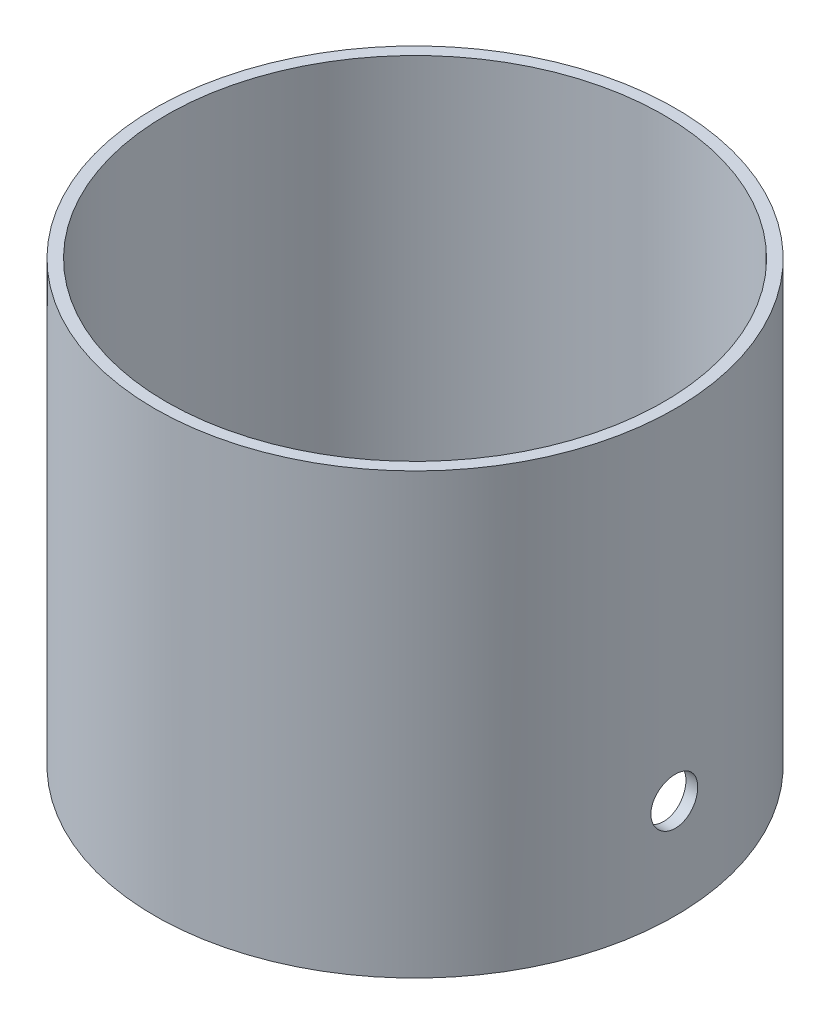
ISO-10303-21;
HEADER;
FILE_DESCRIPTION(('STEP AP214'),'2;1');
FILE_NAME('part.step','',(''),(''),'','','');
FILE_SCHEMA(('AUTOMOTIVE_DESIGN { 1 0 10303 214 1 1 1 1 }'));
ENDSEC;
DATA;
#1=APPLICATION_CONTEXT('core data for automotive mechanical design processes');
#2=APPLICATION_PROTOCOL_DEFINITION('international standard','automotive_design',2000,#1);
#3=PRODUCT_CONTEXT('',#1,'mechanical');
#4=PRODUCT('Part','Part','',(#3));
#5=PRODUCT_RELATED_PRODUCT_CATEGORY('part','',(#4));
#6=PRODUCT_DEFINITION_FORMATION('','',#4);
#7=PRODUCT_DEFINITION_CONTEXT('part definition',#1,'design');
#8=PRODUCT_DEFINITION('design','',#6,#7);
#9=PRODUCT_DEFINITION_SHAPE('','',#8);
#10=(LENGTH_UNIT() NAMED_UNIT(*) SI_UNIT(.MILLI.,.METRE.));
#11=(NAMED_UNIT(*) PLANE_ANGLE_UNIT() SI_UNIT($,.RADIAN.));
#12=(NAMED_UNIT(*) SI_UNIT($,.STERADIAN.) SOLID_ANGLE_UNIT());
#13=UNCERTAINTY_MEASURE_WITH_UNIT(LENGTH_MEASURE(1.E-05),#10,'distance_accuracy_value','');
#14=(GEOMETRIC_REPRESENTATION_CONTEXT(3) GLOBAL_UNCERTAINTY_ASSIGNED_CONTEXT((#13)) GLOBAL_UNIT_ASSIGNED_CONTEXT((#10,
#11,#12)) REPRESENTATION_CONTEXT('',''));
#15=CARTESIAN_POINT('',(0.,0.,0.));
#16=DIRECTION('',(0.,0.,1.));
#17=DIRECTION('',(1.,0.,0.));
#18=AXIS2_PLACEMENT_3D('',#15,#16,#17);
#19=CARTESIAN_POINT('',(0.,37.5,0.));
#20=DIRECTION('',(0.,-1.,0.));
#21=DIRECTION('',(0.,0.,-1.));
#22=AXIS2_PLACEMENT_3D('',#19,#20,#21);
#23=CYLINDRICAL_SURFACE('',#22,44.45);
#24=CARTESIAN_POINT('',(0.,37.5,0.));
#25=DIRECTION('',(0.,1.,0.));
#26=DIRECTION('',(0.,0.,1.));
#27=AXIS2_PLACEMENT_3D('',#24,#25,#26);
#28=CIRCLE('',#27,44.45);
#29=CARTESIAN_POINT('',(0.,37.5,44.45));
#30=VERTEX_POINT('',#29);
#31=EDGE_CURVE('E134',#30,#30,#28,.T.);
#32=ORIENTED_EDGE('',*,*,#31,.F.);
#33=EDGE_LOOP('',(#32));
#34=FACE_BOUND('',#33,.T.);
#35=CARTESIAN_POINT('',(0.,-29.5,0.));
#36=DIRECTION('',(0.,1.,0.));
#37=DIRECTION('',(0.,0.,1.));
#38=AXIS2_PLACEMENT_3D('',#35,#36,#37);
#39=CIRCLE('',#38,44.45);
#40=CARTESIAN_POINT('',(-44.2696566510291,-29.5,4.));
#41=VERTEX_POINT('',#40);
#42=CARTESIAN_POINT('',(-44.2696566510291,-29.5,-4.));
#43=VERTEX_POINT('',#42);
#44=EDGE_CURVE('E86',#41,#43,#39,.F.);
#45=ORIENTED_EDGE('',*,*,#44,.F.);
#46=DIRECTION('',(0.,-1.,0.));
#47=VECTOR('',#46,1.);
#48=CARTESIAN_POINT('',(-44.2696566510291,37.5,4.));
#49=LINE('',#48,#47);
#50=CARTESIAN_POINT('',(-44.2696566510291,-37.5,4.));
#51=VERTEX_POINT('',#50);
#52=EDGE_CURVE('E96',#51,#41,#49,.F.);
#53=ORIENTED_EDGE('',*,*,#52,.F.);
#54=CARTESIAN_POINT('',(0.,-37.5,0.));
#55=DIRECTION('',(0.,1.,0.));
#56=DIRECTION('',(0.,0.,1.));
#57=AXIS2_PLACEMENT_3D('',#54,#55,#56);
#58=CIRCLE('',#57,44.45);
#59=CARTESIAN_POINT('',(-44.2696566510291,-37.5,-4.));
#60=VERTEX_POINT('',#59);
#61=EDGE_CURVE('E107',#51,#60,#58,.T.);
#62=ORIENTED_EDGE('',*,*,#61,.T.);
#63=DIRECTION('',(0.,-1.,0.));
#64=VECTOR('',#63,1.);
#65=CARTESIAN_POINT('',(-44.2696566510291,37.5,-4.));
#66=LINE('',#65,#64);
#67=EDGE_CURVE('E97',#43,#60,#66,.T.);
#68=ORIENTED_EDGE('',*,*,#67,.F.);
#69=EDGE_LOOP('',(#45,#53,#62,#68));
#70=FACE_BOUND('',#69,.T.);
#71=CARTESIAN_POINT('',(44.45,-24.55,0.));
#72=CARTESIAN_POINT('',(44.4499976557764,-24.5499902380189,-0.224195243932007));
#73=CARTESIAN_POINT('',(44.4482857586796,-24.5310877604823,-0.44854145199603));
#74=CARTESIAN_POINT('',(44.4416212627403,-24.4559630281362,-0.891021924232705));
#75=CARTESIAN_POINT('',(44.4366650306759,-24.3996989322832,-1.10914893761069));
#76=CARTESIAN_POINT('',(44.4240717134448,-24.25149532707,-1.53271882928095));
#77=CARTESIAN_POINT('',(44.4164361841107,-24.1595765186722,-1.73816898761818));
#78=CARTESIAN_POINT('',(44.3993396115122,-23.942710978894,-2.13067706767654));
#79=CARTESIAN_POINT('',(44.3898789484413,-23.8177711241218,-2.31773880765753));
#80=CARTESIAN_POINT('',(44.3701618584907,-23.538013709361,-2.66875860486678));
#81=CARTESIAN_POINT('',(44.3599034153576,-23.3831188725493,-2.83265496597804));
#82=CARTESIAN_POINT('',(44.3397637790807,-23.0480123717276,-3.13216185069836));
#83=CARTESIAN_POINT('',(44.3298826028496,-22.8677995744112,-3.26777110741782));
#84=CARTESIAN_POINT('',(44.3115950772525,-22.4867938517307,-3.50706726099331));
#85=CARTESIAN_POINT('',(44.3031912746875,-22.2859663148574,-3.61069926094608));
#86=CARTESIAN_POINT('',(44.2888339268265,-21.8696726110183,-3.78274856498564));
#87=CARTESIAN_POINT('',(44.282880331763,-21.6542067414837,-3.85116658433082));
#88=CARTESIAN_POINT('',(44.2741149945261,-21.2153756171884,-3.95066516557335));
#89=CARTESIAN_POINT('',(44.2712947297724,-20.9920335035138,-3.98184702629256));
#90=CARTESIAN_POINT('',(44.2690886471537,-20.5432691943192,-4.00630116720913));
#91=CARTESIAN_POINT('',(44.2697027551006,-20.3178470438364,-3.99957426629839));
#92=CARTESIAN_POINT('',(44.2742882696317,-19.872017303599,-3.94848546644192));
#93=CARTESIAN_POINT('',(44.2782498380205,-19.651596960762,-3.90423385138253));
#94=CARTESIAN_POINT('',(44.2890685002831,-19.2213247818195,-3.77952320069631));
#95=CARTESIAN_POINT('',(44.2959256265456,-19.0114730639595,-3.69906376006355));
#96=CARTESIAN_POINT('',(44.3117741070208,-18.6079447574747,-3.50409858759764));
#97=CARTESIAN_POINT('',(44.3207685460419,-18.4142921004764,-3.38954358432517));
#98=CARTESIAN_POINT('',(44.3398754560836,-18.0489207759267,-3.12967455672256));
#99=CARTESIAN_POINT('',(44.3499879535558,-17.877202627521,-2.98435980458702));
#100=CARTESIAN_POINT('',(44.3702353586129,-17.559933671221,-2.66647865786234));
#101=CARTESIAN_POINT('',(44.3803702175686,-17.4144783319078,-2.49381695838124));
#102=CARTESIAN_POINT('',(44.3994861788192,-17.1546027633622,-2.12647505185384));
#103=CARTESIAN_POINT('',(44.408467280164,-17.0401825596876,-1.93179482667523));
#104=CARTESIAN_POINT('',(44.4242659603444,-16.8456303765035,-1.52587852527672));
#105=CARTESIAN_POINT('',(44.4310832576872,-16.7655028577136,-1.31464029945297));
#106=CARTESIAN_POINT('',(44.4417831312815,-16.6418785904782,-0.881633776456498));
#107=CARTESIAN_POINT('',(44.4456657785689,-16.5983809553705,-0.65986573430557));
#108=CARTESIAN_POINT('',(44.4500497665709,-16.5493714245089,-0.212921982159337));
#109=CARTESIAN_POINT('',(44.4505628410111,-16.5437277101338,0.0122391630799483));
#110=CARTESIAN_POINT('',(44.4481812597109,-16.5702405665696,0.460304289439482));
#111=CARTESIAN_POINT('',(44.4452866411235,-16.6023967252605,0.683208295141879));
#112=CARTESIAN_POINT('',(44.4364226398509,-16.7034872372019,1.12005411680172));
#113=CARTESIAN_POINT('',(44.4304583854795,-16.7723602559647,1.33401023901546));
#114=CARTESIAN_POINT('',(44.416124771339,-16.9448666451804,1.7473306007669));
#115=CARTESIAN_POINT('',(44.4077553674742,-17.0485006529432,1.94669457268968));
#116=CARTESIAN_POINT('',(44.3895196380049,-17.2879168484137,2.3257698401076));
#117=CARTESIAN_POINT('',(44.3796492852677,-17.4237860916642,2.50542595632793));
#118=CARTESIAN_POINT('',(44.3595333492047,-17.7236905272347,2.83942814809082));
#119=CARTESIAN_POINT('',(44.3492877582751,-17.8877262905597,2.99377371040191));
#120=CARTESIAN_POINT('',(44.3295411315491,-18.2398806055965,3.27322774439701));
#121=CARTESIAN_POINT('',(44.3200423443729,-18.4280677112089,3.3982500088563));
#122=CARTESIAN_POINT('',(44.3028976350481,-18.8228427160112,3.61491685503309));
#123=CARTESIAN_POINT('',(44.2952516917856,-19.0294304054808,3.70656181710706));
#124=CARTESIAN_POINT('',(44.282691598046,-19.4548406966304,3.85372669870603));
#125=CARTESIAN_POINT('',(44.2777735007431,-19.6736451148023,3.90929883070575));
#126=CARTESIAN_POINT('',(44.2712131363709,-20.1175254962149,3.98291034231123));
#127=CARTESIAN_POINT('',(44.2695707947307,-20.3426013165723,4.00095057631119));
#128=CARTESIAN_POINT('',(44.269749178788,-20.7917786826091,3.99897558881102));
#129=CARTESIAN_POINT('',(44.2715575797231,-21.015880841075,3.9790958035375));
#130=CARTESIAN_POINT('',(44.2784074680774,-21.4575491323173,3.90212809305312));
#131=CARTESIAN_POINT('',(44.283448959981,-21.6751152560273,3.84504011623267));
#132=CARTESIAN_POINT('',(44.2961936747123,-22.0975405922263,3.69531204509523));
#133=CARTESIAN_POINT('',(44.3038966699824,-22.3024008892935,3.60267499013745));
#134=CARTESIAN_POINT('',(44.321096889982,-22.6936847646778,3.38449300389991));
#135=CARTESIAN_POINT('',(44.3305940934241,-22.8801085616965,3.25894846304706));
#136=CARTESIAN_POINT('',(44.3503531184073,-23.2299212920516,2.97800603919385));
#137=CARTESIAN_POINT('',(44.3606174433502,-23.3932292833563,2.82250754728087));
#138=CARTESIAN_POINT('',(44.3807312617909,-23.6914987835851,2.48626160989567));
#139=CARTESIAN_POINT('',(44.390580654711,-23.8264534510232,2.3055080880156));
#140=CARTESIAN_POINT('',(44.4087755818934,-24.064398357865,1.92347902677319));
#141=CARTESIAN_POINT('',(44.4171179054692,-24.1673206842425,1.72216107131493));
#142=CARTESIAN_POINT('',(44.4313223055567,-24.3377672761405,1.30515993732942));
#143=CARTESIAN_POINT('',(44.4371872110501,-24.4053319380193,1.0894934711315));
#144=CARTESIAN_POINT('',(44.4442823763943,-24.4860734520519,0.727144795673182));
#145=CARTESIAN_POINT('',(44.4464166350714,-24.5100137099705,0.582787822335401));
#146=CARTESIAN_POINT('',(44.4492762089044,-24.5419801412369,0.292308623983443));
#147=CARTESIAN_POINT('',(44.4500015285499,-24.5500063652953,0.146186404595775));
#148=CARTESIAN_POINT('',(44.45,-24.55,0.));
#149=B_SPLINE_CURVE_WITH_KNOTS('',3,(#71,#72,#73,#74,#75,#76,#77,#78,#79,#80,#81,#82,#83,#84,
#85,#86,#87,#88,#89,#90,#91,#92,#93,#94,#95,#96,#97,#98,#99,#100,#101,#102,#103,#104,#105,#106,
#107,#108,#109,#110,#111,#112,#113,#114,#115,#116,#117,#118,#119,#120,#121,#122,#123,#124,#125,
#126,#127,#128,#129,#130,#131,#132,#133,#134,#135,#136,#137,#138,#139,#140,#141,#142,#143,#144,
#145,#146,#147,#148),.UNSPECIFIED.,.T.,.F.,(4,2,2,2,2,2,2,2,2,2,2,2,2,2,2,2,2,2,2,2,2,2,2,2,2,2,
2,2,2,2,2,2,2,2,2,2,2,2,4),(0.,0.672051962545616,1.34485782405961,2.01727364086362,
2.68954953775982,3.3635834589156,4.03764756143233,4.71286250554804,5.38806373430976,
6.06142390179448,6.73476952364266,7.40614303650666,8.07752405926695,8.74988004357751,
9.42225193825913,10.0970208291141,10.7717902756473,11.4466474680994,12.121488324502,
12.7939779585186,13.4664602606634,14.1378227038438,14.8091974564921,15.4824064096649,
16.1556290120576,16.8308066771073,17.5059766478196,18.1801671730832,18.8543423505812,
19.5261141325864,20.197886846374,20.8696021380298,21.5413094605609,22.215313533359,
22.889480052961,23.5650663130635,24.2398790170527,24.6780915832297,25.1163027530254),.UNSPECIFIED.);
#150=CARTESIAN_POINT('',(44.45,-24.55,0.));
#151=VERTEX_POINT('',#150);
#152=EDGE_CURVE('E102',#151,#151,#149,.T.);
#153=ORIENTED_EDGE('',*,*,#152,.F.);
#154=EDGE_LOOP('',(#153));
#155=FACE_BOUND('',#154,.T.);
#156=ADVANCED_FACE('F38',(#34,#70,#155),#23,.T.);
#157=CARTESIAN_POINT('',(0.,37.5,0.));
#158=DIRECTION('',(0.,-1.,0.));
#159=DIRECTION('',(0.,0.,-1.));
#160=AXIS2_PLACEMENT_3D('',#157,#158,#159);
#161=CYLINDRICAL_SURFACE('',#160,42.45);
#162=CARTESIAN_POINT('',(0.,37.5,0.));
#163=DIRECTION('',(0.,1.,0.));
#164=DIRECTION('',(0.,0.,1.));
#165=AXIS2_PLACEMENT_3D('',#162,#163,#164);
#166=CIRCLE('',#165,42.45);
#167=CARTESIAN_POINT('',(0.,37.5,42.45));
#168=VERTEX_POINT('',#167);
#169=EDGE_CURVE('E127',#168,#168,#166,.T.);
#170=ORIENTED_EDGE('',*,*,#169,.T.);
#171=EDGE_LOOP('',(#170));
#172=FACE_BOUND('',#171,.T.);
#173=DIRECTION('',(0.,-1.,0.));
#174=VECTOR('',#173,1.);
#175=CARTESIAN_POINT('',(-42.2611227962533,37.5,4.));
#176=LINE('',#175,#174);
#177=CARTESIAN_POINT('',(-42.2611227962533,-29.5,4.));
#178=VERTEX_POINT('',#177);
#179=CARTESIAN_POINT('',(-42.2611227962533,-37.5,4.));
#180=VERTEX_POINT('',#179);
#181=EDGE_CURVE('E11',#178,#180,#176,.T.);
#182=ORIENTED_EDGE('',*,*,#181,.F.);
#183=CARTESIAN_POINT('',(0.,-29.5,0.));
#184=DIRECTION('',(0.,1.,0.));
#185=DIRECTION('',(0.,0.,1.));
#186=AXIS2_PLACEMENT_3D('',#183,#184,#185);
#187=CIRCLE('',#186,42.45);
#188=CARTESIAN_POINT('',(-42.2611227962533,-29.5,-4.));
#189=VERTEX_POINT('',#188);
#190=EDGE_CURVE('E53',#189,#178,#187,.T.);
#191=ORIENTED_EDGE('',*,*,#190,.F.);
#192=DIRECTION('',(0.,-1.,0.));
#193=VECTOR('',#192,1.);
#194=CARTESIAN_POINT('',(-42.2611227962533,37.5,-4.));
#195=LINE('',#194,#193);
#196=CARTESIAN_POINT('',(-42.2611227962533,-37.5,-4.));
#197=VERTEX_POINT('',#196);
#198=EDGE_CURVE('E100',#197,#189,#195,.F.);
#199=ORIENTED_EDGE('',*,*,#198,.F.);
#200=CARTESIAN_POINT('',(0.,-37.5,0.));
#201=DIRECTION('',(0.,1.,0.));
#202=DIRECTION('',(0.,0.,1.));
#203=AXIS2_PLACEMENT_3D('',#200,#201,#202);
#204=CIRCLE('',#203,42.45);
#205=EDGE_CURVE('E126',#180,#197,#204,.T.);
#206=ORIENTED_EDGE('',*,*,#205,.F.);
#207=EDGE_LOOP('',(#182,#191,#199,#206));
#208=FACE_BOUND('',#207,.T.);
#209=CARTESIAN_POINT('',(42.2611227962533,-20.55,4.));
#210=CARTESIAN_POINT('',(42.2611252814585,-20.7741459909631,3.9999902592381));
#211=CARTESIAN_POINT('',(42.262925255553,-20.9984417988707,3.98109603762484));
#212=CARTESIAN_POINT('',(42.2699300153437,-21.4408193980641,3.90600606805907));
#213=CARTESIAN_POINT('',(42.2751385919644,-21.6588939881945,3.84976878748484));
#214=CARTESIAN_POINT('',(42.2883654434657,-22.082358508928,3.70164070263402));
#215=CARTESIAN_POINT('',(42.2963820552457,-22.287755863304,3.60977099874244));
#216=CARTESIAN_POINT('',(42.3143196498063,-22.6801690312219,3.39302537187877));
#217=CARTESIAN_POINT('',(42.3242402436636,-22.8671885869882,3.26815618769247));
#218=CARTESIAN_POINT('',(42.3449040786628,-23.2181901192678,2.98852021074745));
#219=CARTESIAN_POINT('',(42.3556496084557,-23.3821041423933,2.83366828332104));
#220=CARTESIAN_POINT('',(42.3767317288668,-23.6816570077209,2.49864387413951));
#221=CARTESIAN_POINT('',(42.3870683010705,-23.817294577866,2.31847025386172));
#222=CARTESIAN_POINT('',(42.4061901690686,-24.0566763573538,1.93750412744903));
#223=CARTESIAN_POINT('',(42.4149725475298,-24.1603608532636,1.73667394121769));
#224=CARTESIAN_POINT('',(42.4299716649694,-24.3325112821111,1.32035755847594));
#225=CARTESIAN_POINT('',(42.4361884600076,-24.4009779845892,1.10487168232202));
#226=CARTESIAN_POINT('',(42.4453399042872,-24.5005511817253,0.666044216741899));
#227=CARTESIAN_POINT('',(42.4482843112328,-24.5317687675143,0.442728041425468));
#228=CARTESIAN_POINT('',(42.4505923704019,-24.5563011998054,-0.0059921975738186));
#229=CARTESIAN_POINT('',(42.4499561058491,-24.549616927242,-0.231396212608458));
#230=CARTESIAN_POINT('',(42.4451825210493,-24.4986258085514,-0.677139921731078));
#231=CARTESIAN_POINT('',(42.4410563173582,-24.4544384201201,-0.897493416905916));
#232=CARTESIAN_POINT('',(42.4297794889053,-24.3298813576524,-1.32764243354828));
#233=CARTESIAN_POINT('',(42.4226288286613,-24.2495112591289,-1.53743783111862));
#234=CARTESIAN_POINT('',(42.4060880868079,-24.054738417577,-1.94089319421765));
#235=CARTESIAN_POINT('',(42.3966945159572,-23.9402825789104,-2.13452737835346));
#236=CARTESIAN_POINT('',(42.376722579089,-23.6806257892474,-2.49988240653117));
#237=CARTESIAN_POINT('',(42.3661441822521,-23.5354240384093,-2.67160268030598));
#238=CARTESIAN_POINT('',(42.3449418217049,-23.2177248079187,-2.98895461265118));
#239=CARTESIAN_POINT('',(42.3343178406609,-23.0451234534402,-3.13448230157785));
#240=CARTESIAN_POINT('',(42.314262835677,-22.6778853581099,-3.39451375664823));
#241=CARTESIAN_POINT('',(42.3048318131657,-22.4832485908697,-3.50901748563872));
#242=CARTESIAN_POINT('',(42.2882293735678,-22.0773873226345,-3.70374890979461));
#243=CARTESIAN_POINT('',(42.2810583551049,-21.8661599035484,-3.78397055911133));
#244=CARTESIAN_POINT('',(42.2697959803473,-21.4331510737931,-3.90778029652059));
#245=CARTESIAN_POINT('',(42.2657045409437,-21.2113699481094,-3.95136937322342));
#246=CARTESIAN_POINT('',(42.2610786633877,-20.764460912116,-4.00054366988354));
#247=CARTESIAN_POINT('',(42.2605306275968,-20.5393491224436,-4.00627417212078));
#248=CARTESIAN_POINT('',(42.2630177253886,-20.0913683534219,-3.97994983629302));
#249=CARTESIAN_POINT('',(42.266052816072,-19.868499347253,-3.94789545060994));
#250=CARTESIAN_POINT('',(42.275351810429,-19.4317517066828,-3.84703263734518));
#251=CARTESIAN_POINT('',(42.281609707389,-19.2178571448535,-3.77829257644187));
#252=CARTESIAN_POINT('',(42.2966442998053,-18.8046356101398,-3.60607937769471));
#253=CARTESIAN_POINT('',(42.3054210466633,-18.6053089346441,-3.50260553103651));
#254=CARTESIAN_POINT('',(42.3245373621598,-18.2262181608585,-3.26349670906455));
#255=CARTESIAN_POINT('',(42.3348815842556,-18.0465151490922,-3.12776526296906));
#256=CARTESIAN_POINT('',(42.3559519108138,-17.7123915118876,-2.82813281741861));
#257=CARTESIAN_POINT('',(42.3666780236653,-17.557971442268,-2.6642311988346));
#258=CARTESIAN_POINT('',(42.3873444192982,-17.2782979739109,-2.31228160355286));
#259=CARTESIAN_POINT('',(42.3972820854806,-17.1531392112251,-2.12415825024802));
#260=CARTESIAN_POINT('',(42.4152139358893,-16.9361916797159,-1.72947881664503));
#261=CARTESIAN_POINT('',(42.4232081441318,-16.8444024985218,-1.52292296416911));
#262=CARTESIAN_POINT('',(42.4363404541648,-16.6969608384973,-1.0975754484675));
#263=CARTESIAN_POINT('',(42.4414831110893,-16.6412507021121,-0.878803917881297));
#264=CARTESIAN_POINT('',(42.4483515035029,-16.5673602636704,-0.434961323998424));
#265=CARTESIAN_POINT('',(42.450077323506,-16.5491790333538,-0.209890416653503));
#266=CARTESIAN_POINT('',(42.449917610758,-16.5508747255347,0.239231257997942));
#267=CARTESIAN_POINT('',(42.4480460383422,-16.5706045272857,0.463282600324025));
#268=CARTESIAN_POINT('',(42.4409293866728,-16.6472543482088,0.904873565244297));
#269=CARTESIAN_POINT('',(42.435684303996,-16.7041744051189,1.12241318123062));
#270=CARTESIAN_POINT('',(42.4224085918844,-16.8535494176419,1.54480823184693));
#271=CARTESIAN_POINT('',(42.4143782536828,-16.9460006581351,1.74966498998983));
#272=CARTESIAN_POINT('',(42.3964283653532,-17.1637976746271,2.14097514388624));
#273=CARTESIAN_POINT('',(42.3865088331354,-17.2891431387807,2.32742871408335));
#274=CARTESIAN_POINT('',(42.3658466180699,-17.5697227982497,2.6773935918006));
#275=CARTESIAN_POINT('',(42.3551010120897,-17.7250663786978,2.84081702964526));
#276=CARTESIAN_POINT('',(42.3340225879388,-18.0610220577721,3.13934550112805));
#277=CARTESIAN_POINT('',(42.3236898697685,-18.2416402307306,3.27444370770555));
#278=CARTESIAN_POINT('',(42.3045816595534,-18.6234640085824,3.51272493991217));
#279=CARTESIAN_POINT('',(42.2958097938806,-18.8247158871037,3.61583404685012));
#280=CARTESIAN_POINT('',(42.2808599981971,-19.2416273302563,3.78666058092751));
#281=CARTESIAN_POINT('',(42.2746791232323,-19.4572702128091,3.85441821057654));
#282=CARTESIAN_POINT('',(42.2671812198037,-19.8201277187355,3.93558911773384));
#283=CARTESIAN_POINT('',(42.2649199441892,-19.9650172225614,3.95971052125336));
#284=CARTESIAN_POINT('',(42.2618899216256,-20.2565830854005,3.9919191218468));
#285=CARTESIAN_POINT('',(42.2611211692761,-20.4032594379464,4.00000637693705));
#286=CARTESIAN_POINT('',(42.2611227962533,-20.55,4.));
#287=B_SPLINE_CURVE_WITH_KNOTS('',3,(#209,#210,#211,#212,#213,#214,#215,#216,#217,#218,#219,
#220,#221,#222,#223,#224,#225,#226,#227,#228,#229,#230,#231,#232,#233,#234,#235,#236,#237,#238,
#239,#240,#241,#242,#243,#244,#245,#246,#247,#248,#249,#250,#251,#252,#253,#254,#255,#256,#257,
#258,#259,#260,#261,#262,#263,#264,#265,#266,#267,#268,#269,#270,#271,#272,#273,#274,#275,#276,
#277,#278,#279,#280,#281,#282,#283,#284,#285,#286),.UNSPECIFIED.,.T.,.F.,(4,2,2,2,2,2,2,2,2,2,2,
2,2,2,2,2,2,2,2,2,2,2,2,2,2,2,2,2,2,2,2,2,2,2,2,2,2,2,4),(0.,0.671902137107215,1.34455281230956,
2.01680577188037,2.68892155738742,3.36297453984735,4.03705783901082,4.71239332122914,
5.38771404613332,6.06101563135717,6.73430156742236,7.40545091742999,8.0766081414068,
8.74881635016707,9.42104204827927,10.0958799207822,10.770718601444,11.4456762448568,
12.120615672473,12.7929635079727,13.4653032938279,14.1363944738685,14.8074993497378,
15.4806370890869,16.153789624669,16.8290900298219,17.5043820895442,18.1785922913387,
18.8527858166555,19.5243682928373,20.1959514504943,20.8674644069057,21.5389709974424,
22.212974053442,22.8871393740805,23.5628511122764,24.237792731383,24.6776652161399,
25.1175361093042),.UNSPECIFIED.);
#288=CARTESIAN_POINT('',(42.2611227962533,-20.55,4.));
#289=VERTEX_POINT('',#288);
#290=EDGE_CURVE('E42',#289,#289,#287,.T.);
#291=ORIENTED_EDGE('',*,*,#290,.T.);
#292=EDGE_LOOP('',(#291));
#293=FACE_BOUND('',#292,.T.);
#294=ADVANCED_FACE('F144',(#172,#208,#293),#161,.F.);
#295=CARTESIAN_POINT('',(0.,37.5,0.));
#296=DIRECTION('',(0.,1.,0.));
#297=DIRECTION('',(0.,0.,1.));
#298=AXIS2_PLACEMENT_3D('',#295,#296,#297);
#299=PLANE('',#298);
#300=ORIENTED_EDGE('',*,*,#31,.T.);
#301=EDGE_LOOP('',(#300));
#302=FACE_BOUND('',#301,.T.);
#303=ORIENTED_EDGE('',*,*,#169,.F.);
#304=EDGE_LOOP('',(#303));
#305=FACE_BOUND('',#304,.T.);
#306=ADVANCED_FACE('F149',(#302,#305),#299,.T.);
#307=CARTESIAN_POINT('',(0.,-37.5,0.));
#308=DIRECTION('',(0.,1.,0.));
#309=DIRECTION('',(0.,0.,1.));
#310=AXIS2_PLACEMENT_3D('',#307,#308,#309);
#311=PLANE('',#310);
#312=ORIENTED_EDGE('',*,*,#61,.F.);
#313=DIRECTION('',(1.,0.,0.));
#314=VECTOR('',#313,1.);
#315=CARTESIAN_POINT('',(0.,-37.5,4.));
#316=LINE('',#315,#314);
#317=EDGE_CURVE('E123',#51,#180,#316,.T.);
#318=ORIENTED_EDGE('',*,*,#317,.T.);
#319=ORIENTED_EDGE('',*,*,#205,.T.);
#320=DIRECTION('',(-1.,0.,0.));
#321=VECTOR('',#320,1.);
#322=CARTESIAN_POINT('',(0.,-37.5,-4.));
#323=LINE('',#322,#321);
#324=EDGE_CURVE('E60',#197,#60,#323,.T.);
#325=ORIENTED_EDGE('',*,*,#324,.T.);
#326=EDGE_LOOP('',(#312,#318,#319,#325));
#327=FACE_BOUND('',#326,.T.);
#328=ADVANCED_FACE('F147',(#327),#311,.F.);
#329=CARTESIAN_POINT('',(-44.451,-45.5,4.));
#330=DIRECTION('',(0.,0.,1.));
#331=DIRECTION('',(1.,0.,0.));
#332=AXIS2_PLACEMENT_3D('',#329,#330,#331);
#333=PLANE('',#332);
#334=ORIENTED_EDGE('',*,*,#52,.T.);
#335=DIRECTION('',(1.,0.,0.));
#336=VECTOR('',#335,1.);
#337=CARTESIAN_POINT('',(-44.451,-29.5,4.));
#338=LINE('',#337,#336);
#339=EDGE_CURVE('E91',#41,#178,#338,.T.);
#340=ORIENTED_EDGE('',*,*,#339,.T.);
#341=ORIENTED_EDGE('',*,*,#181,.T.);
#342=ORIENTED_EDGE('',*,*,#317,.F.);
#343=EDGE_LOOP('',(#334,#340,#341,#342));
#344=FACE_BOUND('',#343,.T.);
#345=ADVANCED_FACE('F142',(#344),#333,.F.);
#346=CARTESIAN_POINT('',(-44.451,-45.5,-4.));
#347=DIRECTION('',(0.,0.,-1.));
#348=DIRECTION('',(-1.,0.,0.));
#349=AXIS2_PLACEMENT_3D('',#346,#347,#348);
#350=PLANE('',#349);
#351=ORIENTED_EDGE('',*,*,#198,.T.);
#352=DIRECTION('',(1.,0.,0.));
#353=VECTOR('',#352,1.);
#354=CARTESIAN_POINT('',(-44.451,-29.5,-4.));
#355=LINE('',#354,#353);
#356=EDGE_CURVE('E89',#43,#189,#355,.T.);
#357=ORIENTED_EDGE('',*,*,#356,.F.);
#358=ORIENTED_EDGE('',*,*,#67,.T.);
#359=ORIENTED_EDGE('',*,*,#324,.F.);
#360=EDGE_LOOP('',(#351,#357,#358,#359));
#361=FACE_BOUND('',#360,.T.);
#362=ADVANCED_FACE('F99',(#361),#350,.F.);
#363=CARTESIAN_POINT('',(-44.451,-29.5,-4.));
#364=DIRECTION('',(0.,1.,0.));
#365=DIRECTION('',(0.,0.,1.));
#366=AXIS2_PLACEMENT_3D('',#363,#364,#365);
#367=PLANE('',#366);
#368=ORIENTED_EDGE('',*,*,#190,.T.);
#369=ORIENTED_EDGE('',*,*,#339,.F.);
#370=ORIENTED_EDGE('',*,*,#44,.T.);
#371=ORIENTED_EDGE('',*,*,#356,.T.);
#372=EDGE_LOOP('',(#368,#369,#370,#371));
#373=FACE_BOUND('',#372,.T.);
#374=ADVANCED_FACE('F88',(#373),#367,.F.);
#375=CARTESIAN_POINT('',(44.45,-20.55,0.));
#376=DIRECTION('',(-1.,0.,0.));
#377=DIRECTION('',(0.,0.,1.));
#378=AXIS2_PLACEMENT_3D('',#375,#376,#377);
#379=CYLINDRICAL_SURFACE('',#378,4.);
#380=ORIENTED_EDGE('',*,*,#290,.F.);
#381=EDGE_LOOP('',(#380));
#382=FACE_BOUND('',#381,.T.);
#383=ORIENTED_EDGE('',*,*,#152,.T.);
#384=EDGE_LOOP('',(#383));
#385=FACE_BOUND('',#384,.T.);
#386=ADVANCED_FACE('F173',(#382,#385),#379,.F.);
#387=CLOSED_SHELL('',(#156,#294,#306,#328,#345,#362,#374,#386));
#388=MANIFOLD_SOLID_BREP('B2',#387);
#389=ADVANCED_BREP_SHAPE_REPRESENTATION('',(#18,#388),#14);
#390=SHAPE_DEFINITION_REPRESENTATION(#9,#389);
ENDSEC;
END-ISO-10303-21;
